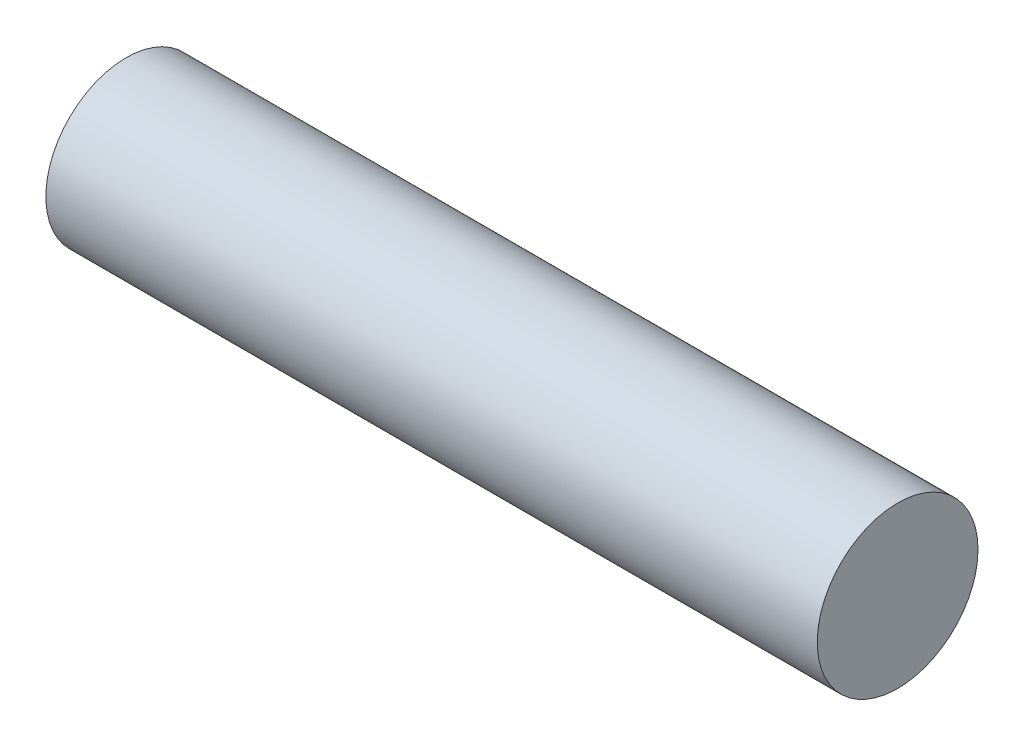
ISO-10303-21;
HEADER;
FILE_DESCRIPTION(('STEP AP214'),'2;1');
FILE_NAME('part.step','',(''),(''),'','','');
FILE_SCHEMA(('AUTOMOTIVE_DESIGN { 1 0 10303 214 1 1 1 1 }'));
ENDSEC;
DATA;
#1=APPLICATION_CONTEXT('core data for automotive mechanical design processes');
#2=APPLICATION_PROTOCOL_DEFINITION('international standard','automotive_design',2000,#1);
#3=PRODUCT_CONTEXT('',#1,'mechanical');
#4=PRODUCT('Part','Part','',(#3));
#5=PRODUCT_RELATED_PRODUCT_CATEGORY('part','',(#4));
#6=PRODUCT_DEFINITION_FORMATION('','',#4);
#7=PRODUCT_DEFINITION_CONTEXT('part definition',#1,'design');
#8=PRODUCT_DEFINITION('design','',#6,#7);
#9=PRODUCT_DEFINITION_SHAPE('','',#8);
#10=(LENGTH_UNIT() NAMED_UNIT(*) SI_UNIT(.MILLI.,.METRE.));
#11=(NAMED_UNIT(*) PLANE_ANGLE_UNIT() SI_UNIT($,.RADIAN.));
#12=(NAMED_UNIT(*) SI_UNIT($,.STERADIAN.) SOLID_ANGLE_UNIT());
#13=UNCERTAINTY_MEASURE_WITH_UNIT(LENGTH_MEASURE(1.E-05),#10,'distance_accuracy_value','');
#14=(GEOMETRIC_REPRESENTATION_CONTEXT(3) GLOBAL_UNCERTAINTY_ASSIGNED_CONTEXT((#13)) GLOBAL_UNIT_ASSIGNED_CONTEXT((#10,
#11,#12)) REPRESENTATION_CONTEXT('',''));
#15=CARTESIAN_POINT('',(0.,0.,0.));
#16=DIRECTION('',(0.,0.,1.));
#17=DIRECTION('',(1.,0.,0.));
#18=AXIS2_PLACEMENT_3D('',#15,#16,#17);
#19=CARTESIAN_POINT('',(60.,0.,0.));
#20=DIRECTION('',(-1.,0.,0.));
#21=DIRECTION('',(0.,0.,1.));
#22=AXIS2_PLACEMENT_3D('',#19,#20,#21);
#23=CYLINDRICAL_SURFACE('',#22,12.5);
#24=CARTESIAN_POINT('',(60.,0.,0.));
#25=DIRECTION('',(1.,0.,0.));
#26=DIRECTION('',(0.,0.,-1.));
#27=AXIS2_PLACEMENT_3D('',#24,#25,#26);
#28=CIRCLE('',#27,12.5);
#29=CARTESIAN_POINT('',(60.,0.,-12.5));
#30=VERTEX_POINT('',#29);
#31=EDGE_CURVE('E10',#30,#30,#28,.T.);
#32=ORIENTED_EDGE('',*,*,#31,.F.);
#33=EDGE_LOOP('',(#32));
#34=FACE_BOUND('',#33,.T.);
#35=CARTESIAN_POINT('',(-60.,0.,0.));
#36=DIRECTION('',(1.,0.,0.));
#37=DIRECTION('',(0.,0.,-1.));
#38=AXIS2_PLACEMENT_3D('',#35,#36,#37);
#39=CIRCLE('',#38,12.5);
#40=CARTESIAN_POINT('',(-60.,0.,-12.5));
#41=VERTEX_POINT('',#40);
#42=EDGE_CURVE('E36',#41,#41,#39,.T.);
#43=ORIENTED_EDGE('',*,*,#42,.T.);
#44=EDGE_LOOP('',(#43));
#45=FACE_BOUND('',#44,.T.);
#46=ADVANCED_FACE('F33',(#34,#45),#23,.T.);
#47=CARTESIAN_POINT('',(60.,0.,0.));
#48=DIRECTION('',(1.,0.,0.));
#49=DIRECTION('',(0.,0.,-1.));
#50=AXIS2_PLACEMENT_3D('',#47,#48,#49);
#51=PLANE('',#50);
#52=ORIENTED_EDGE('',*,*,#31,.T.);
#53=EDGE_LOOP('',(#52));
#54=FACE_BOUND('',#53,.T.);
#55=ADVANCED_FACE('F48',(#54),#51,.T.);
#56=CARTESIAN_POINT('',(-60.,0.,0.));
#57=DIRECTION('',(1.,0.,0.));
#58=DIRECTION('',(0.,0.,-1.));
#59=AXIS2_PLACEMENT_3D('',#56,#57,#58);
#60=PLANE('',#59);
#61=ORIENTED_EDGE('',*,*,#42,.F.);
#62=EDGE_LOOP('',(#61));
#63=FACE_BOUND('',#62,.T.);
#64=ADVANCED_FACE('F46',(#63),#60,.F.);
#65=CLOSED_SHELL('',(#46,#55,#64));
#66=MANIFOLD_SOLID_BREP('B2',#65);
#67=ADVANCED_BREP_SHAPE_REPRESENTATION('',(#18,#66),#14);
#68=SHAPE_DEFINITION_REPRESENTATION(#9,#67);
ENDSEC;
END-ISO-10303-21;
